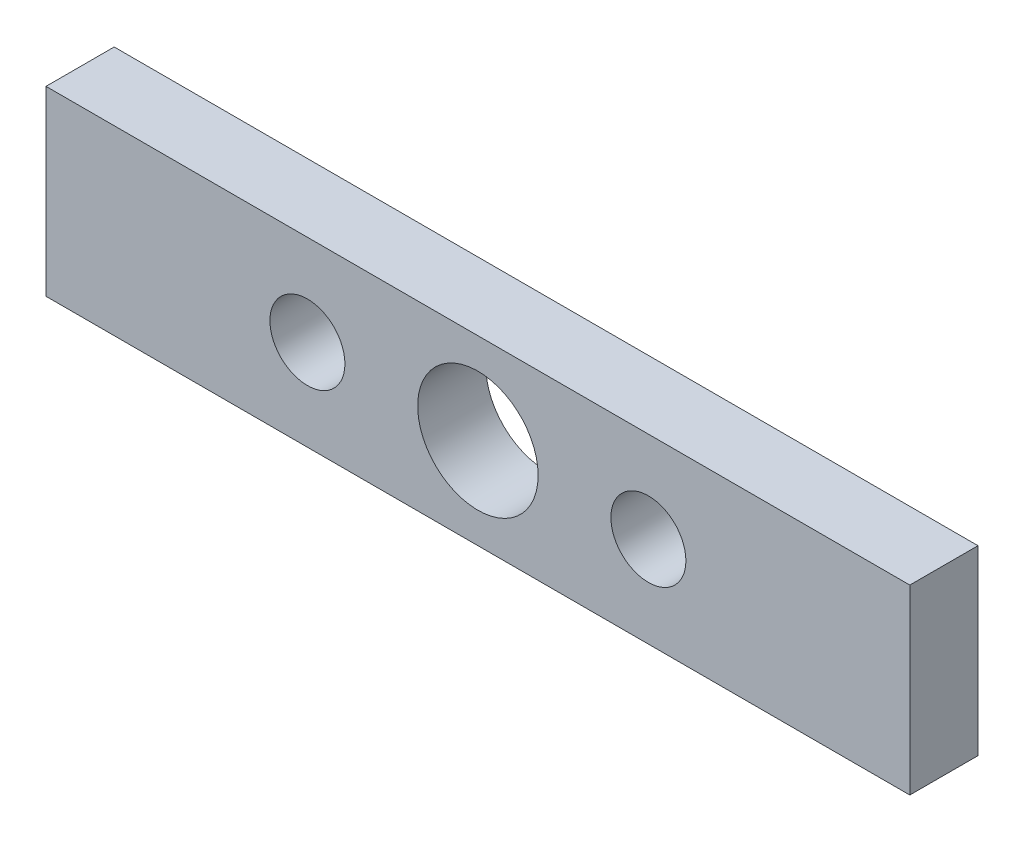
ISO-10303-21;
HEADER;
FILE_DESCRIPTION(('STEP AP214'),'2;1');
FILE_NAME('part.step','',(''),(''),'','','');
FILE_SCHEMA(('AUTOMOTIVE_DESIGN { 1 0 10303 214 1 1 1 1 }'));
ENDSEC;
DATA;
#1=APPLICATION_CONTEXT('core data for automotive mechanical design processes');
#2=APPLICATION_PROTOCOL_DEFINITION('international standard','automotive_design',2000,#1);
#3=PRODUCT_CONTEXT('',#1,'mechanical');
#4=PRODUCT('Part','Part','',(#3));
#5=PRODUCT_RELATED_PRODUCT_CATEGORY('part','',(#4));
#6=PRODUCT_DEFINITION_FORMATION('','',#4);
#7=PRODUCT_DEFINITION_CONTEXT('part definition',#1,'design');
#8=PRODUCT_DEFINITION('design','',#6,#7);
#9=PRODUCT_DEFINITION_SHAPE('','',#8);
#10=(LENGTH_UNIT() NAMED_UNIT(*) SI_UNIT(.MILLI.,.METRE.));
#11=(NAMED_UNIT(*) PLANE_ANGLE_UNIT() SI_UNIT($,.RADIAN.));
#12=(NAMED_UNIT(*) SI_UNIT($,.STERADIAN.) SOLID_ANGLE_UNIT());
#13=UNCERTAINTY_MEASURE_WITH_UNIT(LENGTH_MEASURE(1.E-05),#10,'distance_accuracy_value','');
#14=(GEOMETRIC_REPRESENTATION_CONTEXT(3) GLOBAL_UNCERTAINTY_ASSIGNED_CONTEXT((#13)) GLOBAL_UNIT_ASSIGNED_CONTEXT((#10,
#11,#12)) REPRESENTATION_CONTEXT('',''));
#15=CARTESIAN_POINT('',(0.,0.,0.));
#16=DIRECTION('',(0.,0.,1.));
#17=DIRECTION('',(1.,0.,0.));
#18=AXIS2_PLACEMENT_3D('',#15,#16,#17);
#19=CARTESIAN_POINT('',(-19.,0.,3.));
#20=DIRECTION('',(1.,0.,0.));
#21=DIRECTION('',(0.,0.,-1.));
#22=AXIS2_PLACEMENT_3D('',#19,#20,#21);
#23=PLANE('',#22);
#24=DIRECTION('',(0.,-1.,0.));
#25=VECTOR('',#24,1.);
#26=CARTESIAN_POINT('',(-19.,0.,0.));
#27=LINE('',#26,#25);
#28=CARTESIAN_POINT('',(-19.,8.,0.));
#29=VERTEX_POINT('',#28);
#30=CARTESIAN_POINT('',(-19.,0.,0.));
#31=VERTEX_POINT('',#30);
#32=EDGE_CURVE('E94',#29,#31,#27,.T.);
#33=ORIENTED_EDGE('',*,*,#32,.T.);
#34=DIRECTION('',(0.,0.,-1.));
#35=VECTOR('',#34,1.);
#36=CARTESIAN_POINT('',(-19.,0.,3.));
#37=LINE('',#36,#35);
#38=CARTESIAN_POINT('',(-19.,0.,3.));
#39=VERTEX_POINT('',#38);
#40=EDGE_CURVE('E11',#39,#31,#37,.T.);
#41=ORIENTED_EDGE('',*,*,#40,.F.);
#42=DIRECTION('',(0.,-1.,0.));
#43=VECTOR('',#42,1.);
#44=CARTESIAN_POINT('',(-19.,0.,3.));
#45=LINE('',#44,#43);
#46=CARTESIAN_POINT('',(-19.,8.,3.));
#47=VERTEX_POINT('',#46);
#48=EDGE_CURVE('E82',#47,#39,#45,.T.);
#49=ORIENTED_EDGE('',*,*,#48,.F.);
#50=DIRECTION('',(0.,0.,-1.));
#51=VECTOR('',#50,1.);
#52=CARTESIAN_POINT('',(-19.,8.,3.));
#53=LINE('',#52,#51);
#54=EDGE_CURVE('E90',#47,#29,#53,.T.);
#55=ORIENTED_EDGE('',*,*,#54,.T.);
#56=EDGE_LOOP('',(#33,#41,#49,#55));
#57=FACE_BOUND('',#56,.T.);
#58=ADVANCED_FACE('F31',(#57),#23,.F.);
#59=CARTESIAN_POINT('',(-19.,0.,3.));
#60=DIRECTION('',(0.,1.,0.));
#61=DIRECTION('',(0.,0.,1.));
#62=AXIS2_PLACEMENT_3D('',#59,#60,#61);
#63=PLANE('',#62);
#64=DIRECTION('',(1.,0.,0.));
#65=VECTOR('',#64,1.);
#66=CARTESIAN_POINT('',(-19.,0.,0.));
#67=LINE('',#66,#65);
#68=CARTESIAN_POINT('',(19.,0.,0.));
#69=VERTEX_POINT('',#68);
#70=EDGE_CURVE('E86',#31,#69,#67,.T.);
#71=ORIENTED_EDGE('',*,*,#70,.T.);
#72=DIRECTION('',(0.,0.,-1.));
#73=VECTOR('',#72,1.);
#74=CARTESIAN_POINT('',(19.,0.,3.));
#75=LINE('',#74,#73);
#76=CARTESIAN_POINT('',(19.,0.,3.));
#77=VERTEX_POINT('',#76);
#78=EDGE_CURVE('E39',#77,#69,#75,.T.);
#79=ORIENTED_EDGE('',*,*,#78,.F.);
#80=DIRECTION('',(1.,0.,0.));
#81=VECTOR('',#80,1.);
#82=CARTESIAN_POINT('',(-19.,0.,3.));
#83=LINE('',#82,#81);
#84=EDGE_CURVE('E77',#39,#77,#83,.T.);
#85=ORIENTED_EDGE('',*,*,#84,.F.);
#86=ORIENTED_EDGE('',*,*,#40,.T.);
#87=EDGE_LOOP('',(#71,#79,#85,#86));
#88=FACE_BOUND('',#87,.T.);
#89=ADVANCED_FACE('F85',(#88),#63,.F.);
#90=CARTESIAN_POINT('',(19.,0.,3.));
#91=DIRECTION('',(-1.,0.,0.));
#92=DIRECTION('',(0.,0.,1.));
#93=AXIS2_PLACEMENT_3D('',#90,#91,#92);
#94=PLANE('',#93);
#95=DIRECTION('',(0.,1.,0.));
#96=VECTOR('',#95,1.);
#97=CARTESIAN_POINT('',(19.,0.,0.));
#98=LINE('',#97,#96);
#99=CARTESIAN_POINT('',(19.,8.,0.));
#100=VERTEX_POINT('',#99);
#101=EDGE_CURVE('E64',#69,#100,#98,.T.);
#102=ORIENTED_EDGE('',*,*,#101,.T.);
#103=DIRECTION('',(0.,0.,-1.));
#104=VECTOR('',#103,1.);
#105=CARTESIAN_POINT('',(19.,8.,3.));
#106=LINE('',#105,#104);
#107=CARTESIAN_POINT('',(19.,8.,3.));
#108=VERTEX_POINT('',#107);
#109=EDGE_CURVE('E87',#108,#100,#106,.T.);
#110=ORIENTED_EDGE('',*,*,#109,.F.);
#111=DIRECTION('',(0.,1.,0.));
#112=VECTOR('',#111,1.);
#113=CARTESIAN_POINT('',(19.,0.,3.));
#114=LINE('',#113,#112);
#115=EDGE_CURVE('E80',#77,#108,#114,.T.);
#116=ORIENTED_EDGE('',*,*,#115,.F.);
#117=ORIENTED_EDGE('',*,*,#78,.T.);
#118=EDGE_LOOP('',(#102,#110,#116,#117));
#119=FACE_BOUND('',#118,.T.);
#120=ADVANCED_FACE('F88',(#119),#94,.F.);
#121=CARTESIAN_POINT('',(-19.,8.,3.));
#122=DIRECTION('',(0.,-1.,0.));
#123=DIRECTION('',(0.,0.,-1.));
#124=AXIS2_PLACEMENT_3D('',#121,#122,#123);
#125=PLANE('',#124);
#126=DIRECTION('',(-1.,0.,0.));
#127=VECTOR('',#126,1.);
#128=CARTESIAN_POINT('',(-19.,8.,0.));
#129=LINE('',#128,#127);
#130=EDGE_CURVE('E70',#100,#29,#129,.T.);
#131=ORIENTED_EDGE('',*,*,#130,.T.);
#132=ORIENTED_EDGE('',*,*,#54,.F.);
#133=DIRECTION('',(-1.,0.,0.));
#134=VECTOR('',#133,1.);
#135=CARTESIAN_POINT('',(-19.,8.,3.));
#136=LINE('',#135,#134);
#137=EDGE_CURVE('E47',#108,#47,#136,.T.);
#138=ORIENTED_EDGE('',*,*,#137,.F.);
#139=ORIENTED_EDGE('',*,*,#109,.T.);
#140=EDGE_LOOP('',(#131,#132,#138,#139));
#141=FACE_BOUND('',#140,.T.);
#142=ADVANCED_FACE('F102',(#141),#125,.F.);
#143=CARTESIAN_POINT('',(-19.,8.,3.));
#144=DIRECTION('',(0.,0.,-1.));
#145=DIRECTION('',(-1.,0.,0.));
#146=AXIS2_PLACEMENT_3D('',#143,#144,#145);
#147=PLANE('',#146);
#148=CARTESIAN_POINT('',(7.5,4.,3.));
#149=DIRECTION('',(0.,0.,1.));
#150=DIRECTION('',(1.,0.,0.));
#151=AXIS2_PLACEMENT_3D('',#148,#149,#150);
#152=CIRCLE('',#151,1.65);
#153=CARTESIAN_POINT('',(9.15,4.,3.));
#154=VERTEX_POINT('',#153);
#155=EDGE_CURVE('E120',#154,#154,#152,.T.);
#156=ORIENTED_EDGE('',*,*,#155,.F.);
#157=EDGE_LOOP('',(#156));
#158=FACE_BOUND('',#157,.T.);
#159=CARTESIAN_POINT('',(-7.5,4.,3.));
#160=DIRECTION('',(0.,0.,1.));
#161=DIRECTION('',(1.,0.,0.));
#162=AXIS2_PLACEMENT_3D('',#159,#160,#161);
#163=CIRCLE('',#162,1.65);
#164=CARTESIAN_POINT('',(-5.85,4.,3.));
#165=VERTEX_POINT('',#164);
#166=EDGE_CURVE('E114',#165,#165,#163,.T.);
#167=ORIENTED_EDGE('',*,*,#166,.F.);
#168=EDGE_LOOP('',(#167));
#169=FACE_BOUND('',#168,.T.);
#170=CARTESIAN_POINT('',(0.,4.,3.));
#171=DIRECTION('',(0.,0.,1.));
#172=DIRECTION('',(1.,0.,0.));
#173=AXIS2_PLACEMENT_3D('',#170,#171,#172);
#174=CIRCLE('',#173,2.65);
#175=CARTESIAN_POINT('',(2.65,4.,3.));
#176=VERTEX_POINT('',#175);
#177=EDGE_CURVE('E108',#176,#176,#174,.T.);
#178=ORIENTED_EDGE('',*,*,#177,.F.);
#179=EDGE_LOOP('',(#178));
#180=FACE_BOUND('',#179,.T.);
#181=ORIENTED_EDGE('',*,*,#48,.T.);
#182=ORIENTED_EDGE('',*,*,#84,.T.);
#183=ORIENTED_EDGE('',*,*,#115,.T.);
#184=ORIENTED_EDGE('',*,*,#137,.T.);
#185=EDGE_LOOP('',(#181,#182,#183,#184));
#186=FACE_BOUND('',#185,.T.);
#187=ADVANCED_FACE('F78',(#158,#169,#180,#186),#147,.F.);
#188=CARTESIAN_POINT('',(-19.,8.,0.));
#189=DIRECTION('',(0.,0.,-1.));
#190=DIRECTION('',(-1.,0.,0.));
#191=AXIS2_PLACEMENT_3D('',#188,#189,#190);
#192=PLANE('',#191);
#193=CARTESIAN_POINT('',(7.5,4.,0.));
#194=DIRECTION('',(0.,0.,1.));
#195=DIRECTION('',(1.,0.,0.));
#196=AXIS2_PLACEMENT_3D('',#193,#194,#195);
#197=CIRCLE('',#196,1.65);
#198=CARTESIAN_POINT('',(9.15,4.,0.));
#199=VERTEX_POINT('',#198);
#200=EDGE_CURVE('E117',#199,#199,#197,.T.);
#201=ORIENTED_EDGE('',*,*,#200,.T.);
#202=EDGE_LOOP('',(#201));
#203=FACE_BOUND('',#202,.T.);
#204=CARTESIAN_POINT('',(-7.5,4.,0.));
#205=DIRECTION('',(0.,0.,1.));
#206=DIRECTION('',(1.,0.,0.));
#207=AXIS2_PLACEMENT_3D('',#204,#205,#206);
#208=CIRCLE('',#207,1.65);
#209=CARTESIAN_POINT('',(-5.85,4.,0.));
#210=VERTEX_POINT('',#209);
#211=EDGE_CURVE('E111',#210,#210,#208,.T.);
#212=ORIENTED_EDGE('',*,*,#211,.T.);
#213=EDGE_LOOP('',(#212));
#214=FACE_BOUND('',#213,.T.);
#215=CARTESIAN_POINT('',(0.,4.,0.));
#216=DIRECTION('',(0.,0.,1.));
#217=DIRECTION('',(1.,0.,0.));
#218=AXIS2_PLACEMENT_3D('',#215,#216,#217);
#219=CIRCLE('',#218,2.65);
#220=CARTESIAN_POINT('',(2.65,4.,0.));
#221=VERTEX_POINT('',#220);
#222=EDGE_CURVE('E97',#221,#221,#219,.T.);
#223=ORIENTED_EDGE('',*,*,#222,.T.);
#224=EDGE_LOOP('',(#223));
#225=FACE_BOUND('',#224,.T.);
#226=ORIENTED_EDGE('',*,*,#32,.F.);
#227=ORIENTED_EDGE('',*,*,#130,.F.);
#228=ORIENTED_EDGE('',*,*,#101,.F.);
#229=ORIENTED_EDGE('',*,*,#70,.F.);
#230=EDGE_LOOP('',(#226,#227,#228,#229));
#231=FACE_BOUND('',#230,.T.);
#232=ADVANCED_FACE('F105',(#203,#214,#225,#231),#192,.T.);
#233=CARTESIAN_POINT('',(0.,4.,0.));
#234=DIRECTION('',(0.,0.,1.));
#235=DIRECTION('',(1.,0.,0.));
#236=AXIS2_PLACEMENT_3D('',#233,#234,#235);
#237=CYLINDRICAL_SURFACE('',#236,2.65);
#238=ORIENTED_EDGE('',*,*,#222,.F.);
#239=EDGE_LOOP('',(#238));
#240=FACE_BOUND('',#239,.T.);
#241=ORIENTED_EDGE('',*,*,#177,.T.);
#242=EDGE_LOOP('',(#241));
#243=FACE_BOUND('',#242,.T.);
#244=ADVANCED_FACE('F142',(#240,#243),#237,.F.);
#245=CARTESIAN_POINT('',(-7.5,4.,0.));
#246=DIRECTION('',(0.,0.,1.));
#247=DIRECTION('',(1.,0.,0.));
#248=AXIS2_PLACEMENT_3D('',#245,#246,#247);
#249=CYLINDRICAL_SURFACE('',#248,1.65);
#250=ORIENTED_EDGE('',*,*,#211,.F.);
#251=EDGE_LOOP('',(#250));
#252=FACE_BOUND('',#251,.T.);
#253=ORIENTED_EDGE('',*,*,#166,.T.);
#254=EDGE_LOOP('',(#253));
#255=FACE_BOUND('',#254,.T.);
#256=ADVANCED_FACE('F131',(#252,#255),#249,.F.);
#257=CARTESIAN_POINT('',(7.5,4.,0.));
#258=DIRECTION('',(0.,0.,1.));
#259=DIRECTION('',(1.,0.,0.));
#260=AXIS2_PLACEMENT_3D('',#257,#258,#259);
#261=CYLINDRICAL_SURFACE('',#260,1.65);
#262=ORIENTED_EDGE('',*,*,#200,.F.);
#263=EDGE_LOOP('',(#262));
#264=FACE_BOUND('',#263,.T.);
#265=ORIENTED_EDGE('',*,*,#155,.T.);
#266=EDGE_LOOP('',(#265));
#267=FACE_BOUND('',#266,.T.);
#268=ADVANCED_FACE('F128',(#264,#267),#261,.F.);
#269=CLOSED_SHELL('',(#58,#89,#120,#142,#187,#232,#244,#256,#268));
#270=MANIFOLD_SOLID_BREP('B2',#269);
#271=ADVANCED_BREP_SHAPE_REPRESENTATION('',(#18,#270),#14);
#272=SHAPE_DEFINITION_REPRESENTATION(#9,#271);
ENDSEC;
END-ISO-10303-21;
